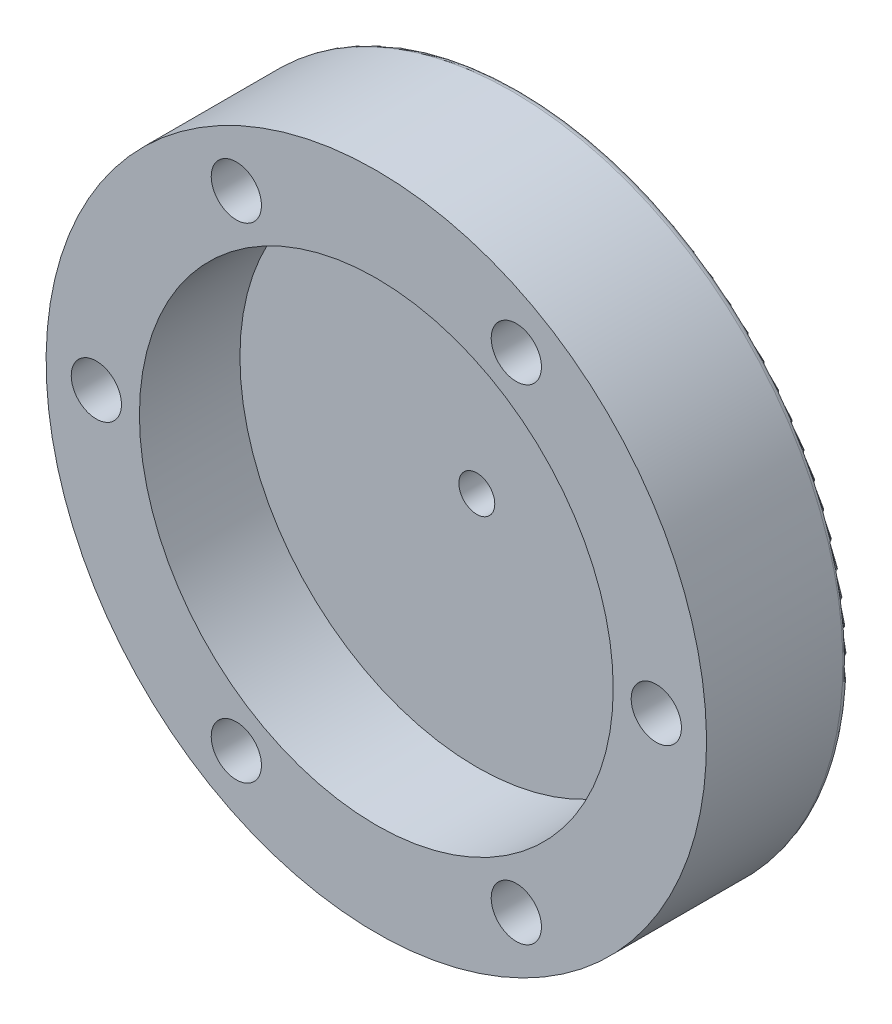
ISO-10303-21;
HEADER;
FILE_DESCRIPTION(('STEP AP214'),'2;1');
FILE_NAME('part.step','',(''),(''),'','','');
FILE_SCHEMA(('AUTOMOTIVE_DESIGN { 1 0 10303 214 1 1 1 1 }'));
ENDSEC;
DATA;
#1=APPLICATION_CONTEXT('core data for automotive mechanical design processes');
#2=APPLICATION_PROTOCOL_DEFINITION('international standard','automotive_design',2000,#1);
#3=PRODUCT_CONTEXT('',#1,'mechanical');
#4=PRODUCT('Part','Part','',(#3));
#5=PRODUCT_RELATED_PRODUCT_CATEGORY('part','',(#4));
#6=PRODUCT_DEFINITION_FORMATION('','',#4);
#7=PRODUCT_DEFINITION_CONTEXT('part definition',#1,'design');
#8=PRODUCT_DEFINITION('design','',#6,#7);
#9=PRODUCT_DEFINITION_SHAPE('','',#8);
#10=(LENGTH_UNIT() NAMED_UNIT(*) SI_UNIT(.MILLI.,.METRE.));
#11=(NAMED_UNIT(*) PLANE_ANGLE_UNIT() SI_UNIT($,.RADIAN.));
#12=(NAMED_UNIT(*) SI_UNIT($,.STERADIAN.) SOLID_ANGLE_UNIT());
#13=UNCERTAINTY_MEASURE_WITH_UNIT(LENGTH_MEASURE(1.E-05),#10,'distance_accuracy_value','');
#14=(GEOMETRIC_REPRESENTATION_CONTEXT(3) GLOBAL_UNCERTAINTY_ASSIGNED_CONTEXT((#13)) GLOBAL_UNIT_ASSIGNED_CONTEXT((#10,
#11,#12)) REPRESENTATION_CONTEXT('',''));
#15=CARTESIAN_POINT('',(0.,0.,0.));
#16=DIRECTION('',(0.,0.,1.));
#17=DIRECTION('',(1.,0.,0.));
#18=AXIS2_PLACEMENT_3D('',#15,#16,#17);
#19=CARTESIAN_POINT('',(0.,0.,0.));
#20=DIRECTION('',(0.,0.,1.));
#21=DIRECTION('',(0.,-1.,0.));
#22=AXIS2_PLACEMENT_3D('',#19,#20,#21);
#23=PLANE('',#22);
#24=CARTESIAN_POINT('',(0.,0.,0.));
#25=DIRECTION('',(0.,0.,1.));
#26=DIRECTION('',(0.,-1.,0.));
#27=AXIS2_PLACEMENT_3D('',#24,#25,#26);
#28=CIRCLE('',#27,2.5);
#29=CARTESIAN_POINT('',(0.,-2.5,0.));
#30=VERTEX_POINT('',#29);
#31=EDGE_CURVE('E51',#30,#30,#28,.T.);
#32=ORIENTED_EDGE('',*,*,#31,.F.);
#33=EDGE_LOOP('',(#32));
#34=FACE_BOUND('',#33,.T.);
#35=CARTESIAN_POINT('',(0.,0.,0.));
#36=DIRECTION('',(0.,0.,-1.));
#37=DIRECTION('',(0.,1.,0.));
#38=AXIS2_PLACEMENT_3D('',#35,#36,#37);
#39=CIRCLE('',#38,33.);
#40=CARTESIAN_POINT('',(0.,33.,0.));
#41=VERTEX_POINT('',#40);
#42=EDGE_CURVE('E61',#41,#41,#39,.T.);
#43=ORIENTED_EDGE('',*,*,#42,.F.);
#44=EDGE_LOOP('',(#43));
#45=FACE_BOUND('',#44,.T.);
#46=ADVANCED_FACE('F31',(#34,#45),#23,.T.);
#47=CARTESIAN_POINT('',(0.,12.,-16.));
#48=DIRECTION('',(0.,0.,-1.));
#49=DIRECTION('',(0.,1.,0.));
#50=AXIS2_PLACEMENT_3D('',#47,#48,#49);
#51=PLANE('',#50);
#52=CARTESIAN_POINT('',(0.,0.,-16.));
#53=DIRECTION('',(0.,0.,-1.));
#54=DIRECTION('',(0.,1.,0.));
#55=AXIS2_PLACEMENT_3D('',#52,#53,#54);
#56=CIRCLE('',#55,7.);
#57=CARTESIAN_POINT('',(0.,7.,-16.));
#58=VERTEX_POINT('',#57);
#59=EDGE_CURVE('E101',#58,#58,#56,.T.);
#60=ORIENTED_EDGE('',*,*,#59,.F.);
#61=EDGE_LOOP('',(#60));
#62=FACE_BOUND('',#61,.T.);
#63=CARTESIAN_POINT('',(0.,0.,-16.));
#64=DIRECTION('',(0.,0.,-1.));
#65=DIRECTION('',(0.,1.,0.));
#66=AXIS2_PLACEMENT_3D('',#63,#64,#65);
#67=CIRCLE('',#66,12.);
#68=CARTESIAN_POINT('',(0.,12.,-16.));
#69=VERTEX_POINT('',#68);
#70=EDGE_CURVE('E42',#69,#69,#67,.T.);
#71=ORIENTED_EDGE('',*,*,#70,.T.);
#72=EDGE_LOOP('',(#71));
#73=FACE_BOUND('',#72,.T.);
#74=ADVANCED_FACE('F114',(#62,#73),#51,.T.);
#75=CARTESIAN_POINT('',(0.,0.,-16.));
#76=DIRECTION('',(0.,0.,-1.));
#77=DIRECTION('',(0.,1.,0.));
#78=AXIS2_PLACEMENT_3D('',#75,#76,#77);
#79=CYLINDRICAL_SURFACE('',#78,12.);
#80=CARTESIAN_POINT('',(0.,0.,-6.00000000000001));
#81=DIRECTION('',(0.,0.,-1.));
#82=DIRECTION('',(0.,1.,0.));
#83=AXIS2_PLACEMENT_3D('',#80,#81,#82);
#84=CIRCLE('',#83,12.);
#85=CARTESIAN_POINT('',(0.,12.,-6.00000000000001));
#86=VERTEX_POINT('',#85);
#87=EDGE_CURVE('E46',#86,#86,#84,.T.);
#88=ORIENTED_EDGE('',*,*,#87,.T.);
#89=EDGE_LOOP('',(#88));
#90=FACE_BOUND('',#89,.T.);
#91=ORIENTED_EDGE('',*,*,#70,.F.);
#92=EDGE_LOOP('',(#91));
#93=FACE_BOUND('',#92,.T.);
#94=ADVANCED_FACE('F138',(#90,#93),#79,.T.);
#95=CARTESIAN_POINT('',(0.,46.,-6.));
#96=DIRECTION('',(0.,0.,-1.));
#97=DIRECTION('',(0.,1.,0.));
#98=AXIS2_PLACEMENT_3D('',#95,#96,#97);
#99=PLANE('',#98);
#100=CARTESIAN_POINT('',(0.,0.,-6.));
#101=DIRECTION('',(0.,0.,-1.));
#102=DIRECTION('',(0.,1.,0.));
#103=AXIS2_PLACEMENT_3D('',#100,#101,#102);
#104=CIRCLE('',#103,45.);
#105=CARTESIAN_POINT('',(0.,45.,-6.));
#106=VERTEX_POINT('',#105);
#107=EDGE_CURVE('E38',#106,#106,#104,.T.);
#108=ORIENTED_EDGE('',*,*,#107,.T.);
#109=EDGE_LOOP('',(#108));
#110=FACE_BOUND('',#109,.T.);
#111=CARTESIAN_POINT('',(-39.,1.00400460041928E-13,-6.));
#112=DIRECTION('',(0.,0.,-1.));
#113=DIRECTION('',(0.,1.,0.));
#114=AXIS2_PLACEMENT_3D('',#111,#112,#113);
#115=CIRCLE('',#114,3.5);
#116=CARTESIAN_POINT('',(-39.,3.5000000000001,-6.));
#117=VERTEX_POINT('',#116);
#118=EDGE_CURVE('E71',#117,#117,#115,.T.);
#119=ORIENTED_EDGE('',*,*,#118,.F.);
#120=EDGE_LOOP('',(#119));
#121=FACE_BOUND('',#120,.T.);
#122=CARTESIAN_POINT('',(-19.4999999999999,33.7749907475932,-6.));
#123=DIRECTION('',(0.,0.,-1.));
#124=DIRECTION('',(0.,1.,0.));
#125=AXIS2_PLACEMENT_3D('',#122,#123,#124);
#126=CIRCLE('',#125,3.5);
#127=CARTESIAN_POINT('',(-19.4999999999999,37.2749907475932,-6.));
#128=VERTEX_POINT('',#127);
#129=EDGE_CURVE('E78',#128,#128,#126,.T.);
#130=ORIENTED_EDGE('',*,*,#129,.F.);
#131=EDGE_LOOP('',(#130));
#132=FACE_BOUND('',#131,.T.);
#133=CARTESIAN_POINT('',(19.5000000000001,33.7749907475931,-6.));
#134=DIRECTION('',(0.,0.,-1.));
#135=DIRECTION('',(0.,1.,0.));
#136=AXIS2_PLACEMENT_3D('',#133,#134,#135);
#137=CIRCLE('',#136,3.49999999999999);
#138=CARTESIAN_POINT('',(19.5000000000001,37.2749907475931,-6.));
#139=VERTEX_POINT('',#138);
#140=EDGE_CURVE('E84',#139,#139,#137,.T.);
#141=ORIENTED_EDGE('',*,*,#140,.F.);
#142=EDGE_LOOP('',(#141));
#143=FACE_BOUND('',#142,.T.);
#144=CARTESIAN_POINT('',(39.0000000000001,0.,-6.));
#145=DIRECTION('',(0.,0.,-1.));
#146=DIRECTION('',(0.,1.,0.));
#147=AXIS2_PLACEMENT_3D('',#144,#145,#146);
#148=CIRCLE('',#147,3.5);
#149=CARTESIAN_POINT('',(39.0000000000001,3.49999999999995,-6.));
#150=VERTEX_POINT('',#149);
#151=EDGE_CURVE('E90',#150,#150,#148,.T.);
#152=ORIENTED_EDGE('',*,*,#151,.F.);
#153=EDGE_LOOP('',(#152));
#154=FACE_BOUND('',#153,.T.);
#155=CARTESIAN_POINT('',(19.5,-33.7749907475931,-6.));
#156=DIRECTION('',(0.,0.,-1.));
#157=DIRECTION('',(0.,1.,0.));
#158=AXIS2_PLACEMENT_3D('',#155,#156,#157);
#159=CIRCLE('',#158,3.49999999999999);
#160=CARTESIAN_POINT('',(19.5,-30.2749907475932,-6.));
#161=VERTEX_POINT('',#160);
#162=EDGE_CURVE('E96',#161,#161,#159,.T.);
#163=ORIENTED_EDGE('',*,*,#162,.F.);
#164=EDGE_LOOP('',(#163));
#165=FACE_BOUND('',#164,.T.);
#166=CARTESIAN_POINT('',(-19.5000000000001,-33.7749907475931,-6.));
#167=DIRECTION('',(0.,0.,-1.));
#168=DIRECTION('',(0.,1.,0.));
#169=AXIS2_PLACEMENT_3D('',#166,#167,#168);
#170=CIRCLE('',#169,3.5);
#171=CARTESIAN_POINT('',(-19.5000000000001,-30.2749907475931,-6.));
#172=VERTEX_POINT('',#171);
#173=EDGE_CURVE('E65',#172,#172,#170,.T.);
#174=ORIENTED_EDGE('',*,*,#173,.F.);
#175=EDGE_LOOP('',(#174));
#176=FACE_BOUND('',#175,.T.);
#177=ORIENTED_EDGE('',*,*,#87,.F.);
#178=EDGE_LOOP('',(#177));
#179=FACE_BOUND('',#178,.T.);
#180=ADVANCED_FACE('F133',(#110,#121,#132,#143,#154,#165,#176,#179),#99,.T.);
#181=CARTESIAN_POINT('',(0.,0.,-16.));
#182=DIRECTION('',(0.,0.,-1.));
#183=DIRECTION('',(0.,1.,0.));
#184=AXIS2_PLACEMENT_3D('',#181,#182,#183);
#185=CYLINDRICAL_SURFACE('',#184,46.);
#186=CARTESIAN_POINT('',(0.,0.,-5.));
#187=DIRECTION('',(0.,0.,-1.));
#188=DIRECTION('',(0.,1.,0.));
#189=AXIS2_PLACEMENT_3D('',#186,#187,#188);
#190=CIRCLE('',#189,46.);
#191=CARTESIAN_POINT('',(0.,46.,-5.));
#192=VERTEX_POINT('',#191);
#193=EDGE_CURVE('E10',#192,#192,#190,.F.);
#194=ORIENTED_EDGE('',*,*,#193,.T.);
#195=EDGE_LOOP('',(#194));
#196=FACE_BOUND('',#195,.T.);
#197=CARTESIAN_POINT('',(0.,0.,14.));
#198=DIRECTION('',(0.,0.,-1.));
#199=DIRECTION('',(0.,1.,0.));
#200=AXIS2_PLACEMENT_3D('',#197,#198,#199);
#201=CIRCLE('',#200,46.);
#202=CARTESIAN_POINT('',(0.,46.,14.));
#203=VERTEX_POINT('',#202);
#204=EDGE_CURVE('E55',#203,#203,#201,.T.);
#205=ORIENTED_EDGE('',*,*,#204,.T.);
#206=EDGE_LOOP('',(#205));
#207=FACE_BOUND('',#206,.T.);
#208=ADVANCED_FACE('F127',(#196,#207),#185,.T.);
#209=CARTESIAN_POINT('',(0.,33.,14.));
#210=DIRECTION('',(0.,0.,1.));
#211=DIRECTION('',(0.,-1.,0.));
#212=AXIS2_PLACEMENT_3D('',#209,#210,#211);
#213=PLANE('',#212);
#214=CARTESIAN_POINT('',(-39.,1.0111213192435E-13,14.));
#215=DIRECTION('',(0.,0.,-1.));
#216=DIRECTION('',(0.,1.,0.));
#217=AXIS2_PLACEMENT_3D('',#214,#215,#216);
#218=CIRCLE('',#217,3.5);
#219=CARTESIAN_POINT('',(-39.,3.5000000000001,14.));
#220=VERTEX_POINT('',#219);
#221=EDGE_CURVE('E74',#220,#220,#218,.T.);
#222=ORIENTED_EDGE('',*,*,#221,.T.);
#223=EDGE_LOOP('',(#222));
#224=FACE_BOUND('',#223,.T.);
#225=CARTESIAN_POINT('',(-19.4999999999999,33.7749907475932,14.));
#226=DIRECTION('',(0.,0.,-1.));
#227=DIRECTION('',(0.,1.,0.));
#228=AXIS2_PLACEMENT_3D('',#225,#226,#227);
#229=CIRCLE('',#228,3.5);
#230=CARTESIAN_POINT('',(-19.4999999999999,37.2749907475932,14.));
#231=VERTEX_POINT('',#230);
#232=EDGE_CURVE('E81',#231,#231,#229,.T.);
#233=ORIENTED_EDGE('',*,*,#232,.T.);
#234=EDGE_LOOP('',(#233));
#235=FACE_BOUND('',#234,.T.);
#236=CARTESIAN_POINT('',(19.5000000000001,33.7749907475931,14.));
#237=DIRECTION('',(0.,0.,-1.));
#238=DIRECTION('',(0.,1.,0.));
#239=AXIS2_PLACEMENT_3D('',#236,#237,#238);
#240=CIRCLE('',#239,3.49999999999999);
#241=CARTESIAN_POINT('',(19.5000000000001,37.2749907475931,14.));
#242=VERTEX_POINT('',#241);
#243=EDGE_CURVE('E87',#242,#242,#240,.T.);
#244=ORIENTED_EDGE('',*,*,#243,.T.);
#245=EDGE_LOOP('',(#244));
#246=FACE_BOUND('',#245,.T.);
#247=CARTESIAN_POINT('',(39.0000000000001,0.,14.));
#248=DIRECTION('',(0.,0.,-1.));
#249=DIRECTION('',(0.,1.,0.));
#250=AXIS2_PLACEMENT_3D('',#247,#248,#249);
#251=CIRCLE('',#250,3.5);
#252=CARTESIAN_POINT('',(39.0000000000001,3.49999999999996,14.));
#253=VERTEX_POINT('',#252);
#254=EDGE_CURVE('E93',#253,#253,#251,.T.);
#255=ORIENTED_EDGE('',*,*,#254,.T.);
#256=EDGE_LOOP('',(#255));
#257=FACE_BOUND('',#256,.T.);
#258=CARTESIAN_POINT('',(19.5,-33.7749907475931,14.));
#259=DIRECTION('',(0.,0.,-1.));
#260=DIRECTION('',(0.,1.,0.));
#261=AXIS2_PLACEMENT_3D('',#258,#259,#260);
#262=CIRCLE('',#261,3.49999999999999);
#263=CARTESIAN_POINT('',(19.5,-30.2749907475932,14.));
#264=VERTEX_POINT('',#263);
#265=EDGE_CURVE('E68',#264,#264,#262,.T.);
#266=ORIENTED_EDGE('',*,*,#265,.T.);
#267=EDGE_LOOP('',(#266));
#268=FACE_BOUND('',#267,.T.);
#269=CARTESIAN_POINT('',(-19.5000000000001,-33.7749907475931,14.));
#270=DIRECTION('',(0.,0.,-1.));
#271=DIRECTION('',(0.,1.,0.));
#272=AXIS2_PLACEMENT_3D('',#269,#270,#271);
#273=CIRCLE('',#272,3.5);
#274=CARTESIAN_POINT('',(-19.5000000000001,-30.2749907475931,14.));
#275=VERTEX_POINT('',#274);
#276=EDGE_CURVE('E64',#275,#275,#273,.T.);
#277=ORIENTED_EDGE('',*,*,#276,.T.);
#278=EDGE_LOOP('',(#277));
#279=FACE_BOUND('',#278,.T.);
#280=CARTESIAN_POINT('',(0.,0.,14.));
#281=DIRECTION('',(0.,0.,-1.));
#282=DIRECTION('',(0.,1.,0.));
#283=AXIS2_PLACEMENT_3D('',#280,#281,#282);
#284=CIRCLE('',#283,33.);
#285=CARTESIAN_POINT('',(0.,33.,14.));
#286=VERTEX_POINT('',#285);
#287=EDGE_CURVE('E58',#286,#286,#284,.T.);
#288=ORIENTED_EDGE('',*,*,#287,.T.);
#289=EDGE_LOOP('',(#288));
#290=FACE_BOUND('',#289,.T.);
#291=ORIENTED_EDGE('',*,*,#204,.F.);
#292=EDGE_LOOP('',(#291));
#293=FACE_BOUND('',#292,.T.);
#294=ADVANCED_FACE('F121',(#224,#235,#246,#257,#268,#279,#290,#293),#213,.T.);
#295=CARTESIAN_POINT('',(0.,0.,-16.));
#296=DIRECTION('',(0.,0.,-1.));
#297=DIRECTION('',(0.,1.,0.));
#298=AXIS2_PLACEMENT_3D('',#295,#296,#297);
#299=CYLINDRICAL_SURFACE('',#298,33.);
#300=ORIENTED_EDGE('',*,*,#42,.T.);
#301=EDGE_LOOP('',(#300));
#302=FACE_BOUND('',#301,.T.);
#303=ORIENTED_EDGE('',*,*,#287,.F.);
#304=EDGE_LOOP('',(#303));
#305=FACE_BOUND('',#304,.T.);
#306=ADVANCED_FACE('F117',(#302,#305),#299,.F.);
#307=CARTESIAN_POINT('',(-19.5000000000001,-33.7749907475931,14.));
#308=DIRECTION('',(0.,0.,-1.));
#309=DIRECTION('',(0.,1.,0.));
#310=AXIS2_PLACEMENT_3D('',#307,#308,#309);
#311=CYLINDRICAL_SURFACE('',#310,3.5);
#312=ORIENTED_EDGE('',*,*,#276,.F.);
#313=EDGE_LOOP('',(#312));
#314=FACE_BOUND('',#313,.T.);
#315=ORIENTED_EDGE('',*,*,#173,.T.);
#316=EDGE_LOOP('',(#315));
#317=FACE_BOUND('',#316,.T.);
#318=ADVANCED_FACE('F120',(#314,#317),#311,.F.);
#319=CARTESIAN_POINT('',(19.5,-33.7749907475931,14.));
#320=DIRECTION('',(0.,0.,-1.));
#321=DIRECTION('',(0.,1.,0.));
#322=AXIS2_PLACEMENT_3D('',#319,#320,#321);
#323=CYLINDRICAL_SURFACE('',#322,3.49999999999999);
#324=ORIENTED_EDGE('',*,*,#265,.F.);
#325=EDGE_LOOP('',(#324));
#326=FACE_BOUND('',#325,.T.);
#327=ORIENTED_EDGE('',*,*,#162,.T.);
#328=EDGE_LOOP('',(#327));
#329=FACE_BOUND('',#328,.T.);
#330=ADVANCED_FACE('F171',(#326,#329),#323,.F.);
#331=CARTESIAN_POINT('',(39.0000000000001,0.,14.));
#332=DIRECTION('',(0.,0.,-1.));
#333=DIRECTION('',(0.,1.,0.));
#334=AXIS2_PLACEMENT_3D('',#331,#332,#333);
#335=CYLINDRICAL_SURFACE('',#334,3.5);
#336=ORIENTED_EDGE('',*,*,#254,.F.);
#337=EDGE_LOOP('',(#336));
#338=FACE_BOUND('',#337,.T.);
#339=ORIENTED_EDGE('',*,*,#151,.T.);
#340=EDGE_LOOP('',(#339));
#341=FACE_BOUND('',#340,.T.);
#342=ADVANCED_FACE('F174',(#338,#341),#335,.F.);
#343=CARTESIAN_POINT('',(19.5000000000001,33.7749907475931,14.));
#344=DIRECTION('',(0.,0.,-1.));
#345=DIRECTION('',(0.,1.,0.));
#346=AXIS2_PLACEMENT_3D('',#343,#344,#345);
#347=CYLINDRICAL_SURFACE('',#346,3.49999999999999);
#348=ORIENTED_EDGE('',*,*,#243,.F.);
#349=EDGE_LOOP('',(#348));
#350=FACE_BOUND('',#349,.T.);
#351=ORIENTED_EDGE('',*,*,#140,.T.);
#352=EDGE_LOOP('',(#351));
#353=FACE_BOUND('',#352,.T.);
#354=ADVANCED_FACE('F178',(#350,#353),#347,.F.);
#355=CARTESIAN_POINT('',(-19.4999999999999,33.7749907475932,14.));
#356=DIRECTION('',(0.,0.,-1.));
#357=DIRECTION('',(0.,1.,0.));
#358=AXIS2_PLACEMENT_3D('',#355,#356,#357);
#359=CYLINDRICAL_SURFACE('',#358,3.5);
#360=ORIENTED_EDGE('',*,*,#232,.F.);
#361=EDGE_LOOP('',(#360));
#362=FACE_BOUND('',#361,.T.);
#363=ORIENTED_EDGE('',*,*,#129,.T.);
#364=EDGE_LOOP('',(#363));
#365=FACE_BOUND('',#364,.T.);
#366=ADVANCED_FACE('F165',(#362,#365),#359,.F.);
#367=CARTESIAN_POINT('',(-39.,1.0111213192435E-13,14.));
#368=DIRECTION('',(0.,0.,-1.));
#369=DIRECTION('',(0.,1.,0.));
#370=AXIS2_PLACEMENT_3D('',#367,#368,#369);
#371=CYLINDRICAL_SURFACE('',#370,3.5);
#372=ORIENTED_EDGE('',*,*,#221,.F.);
#373=EDGE_LOOP('',(#372));
#374=FACE_BOUND('',#373,.T.);
#375=ORIENTED_EDGE('',*,*,#118,.T.);
#376=EDGE_LOOP('',(#375));
#377=FACE_BOUND('',#376,.T.);
#378=ADVANCED_FACE('F156',(#374,#377),#371,.F.);
#379=CARTESIAN_POINT('',(0.,0.,-6.00000000000001));
#380=DIRECTION('',(0.,0.,-1.));
#381=DIRECTION('',(0.,1.,0.));
#382=AXIS2_PLACEMENT_3D('',#379,#380,#381);
#383=CYLINDRICAL_SURFACE('',#382,7.);
#384=CARTESIAN_POINT('',(0.,0.,-6.00000000000001));
#385=DIRECTION('',(0.,0.,-1.));
#386=DIRECTION('',(0.,1.,0.));
#387=AXIS2_PLACEMENT_3D('',#384,#385,#386);
#388=CIRCLE('',#387,7.);
#389=CARTESIAN_POINT('',(0.,7.,-6.00000000000001));
#390=VERTEX_POINT('',#389);
#391=EDGE_CURVE('E75',#390,#390,#388,.T.);
#392=ORIENTED_EDGE('',*,*,#391,.F.);
#393=EDGE_LOOP('',(#392));
#394=FACE_BOUND('',#393,.T.);
#395=ORIENTED_EDGE('',*,*,#59,.T.);
#396=EDGE_LOOP('',(#395));
#397=FACE_BOUND('',#396,.T.);
#398=ADVANCED_FACE('F153',(#394,#397),#383,.F.);
#399=CARTESIAN_POINT('',(0.,0.,-6.00000000000001));
#400=DIRECTION('',(0.,0.,-1.));
#401=DIRECTION('',(0.,1.,0.));
#402=AXIS2_PLACEMENT_3D('',#399,#400,#401);
#403=PLANE('',#402);
#404=CARTESIAN_POINT('',(0.,0.,-6.00000000000001));
#405=DIRECTION('',(0.,0.,-1.));
#406=DIRECTION('',(0.,1.,0.));
#407=AXIS2_PLACEMENT_3D('',#404,#405,#406);
#408=CIRCLE('',#407,2.5);
#409=CARTESIAN_POINT('',(0.,2.5,-6.00000000000001));
#410=VERTEX_POINT('',#409);
#411=EDGE_CURVE('E49',#410,#410,#408,.T.);
#412=ORIENTED_EDGE('',*,*,#411,.F.);
#413=EDGE_LOOP('',(#412));
#414=FACE_BOUND('',#413,.T.);
#415=ORIENTED_EDGE('',*,*,#391,.T.);
#416=EDGE_LOOP('',(#415));
#417=FACE_BOUND('',#416,.T.);
#418=ADVANCED_FACE('F155',(#414,#417),#403,.T.);
#419=CARTESIAN_POINT('',(0.,0.,14.));
#420=DIRECTION('',(0.,0.,-1.));
#421=DIRECTION('',(0.,1.,0.));
#422=AXIS2_PLACEMENT_3D('',#419,#420,#421);
#423=CYLINDRICAL_SURFACE('',#422,2.5);
#424=ORIENTED_EDGE('',*,*,#31,.T.);
#425=EDGE_LOOP('',(#424));
#426=FACE_BOUND('',#425,.T.);
#427=ORIENTED_EDGE('',*,*,#411,.T.);
#428=EDGE_LOOP('',(#427));
#429=FACE_BOUND('',#428,.T.);
#430=ADVANCED_FACE('F109',(#426,#429),#423,.F.);
#431=CARTESIAN_POINT('',(0.,0.,-5.));
#432=DIRECTION('',(0.,0.,-1.));
#433=DIRECTION('',(0.,1.,0.));
#434=AXIS2_PLACEMENT_3D('',#431,#432,#433);
#435=TOROIDAL_SURFACE('',#434,45.,1.);
#436=ORIENTED_EDGE('',*,*,#193,.F.);
#437=EDGE_LOOP('',(#436));
#438=FACE_BOUND('',#437,.T.);
#439=ORIENTED_EDGE('',*,*,#107,.F.);
#440=EDGE_LOOP('',(#439));
#441=FACE_BOUND('',#440,.T.);
#442=ADVANCED_FACE('F33',(#438,#441),#435,.T.);
#443=CLOSED_SHELL('',(#46,#74,#94,#180,#208,#294,#306,#318,#330,#342,#354,#366,#378,#398,#418,
#430,#442));
#444=MANIFOLD_SOLID_BREP('B2',#443);
#445=ADVANCED_BREP_SHAPE_REPRESENTATION('',(#18,#444),#14);
#446=SHAPE_DEFINITION_REPRESENTATION(#9,#445);
ENDSEC;
END-ISO-10303-21;
